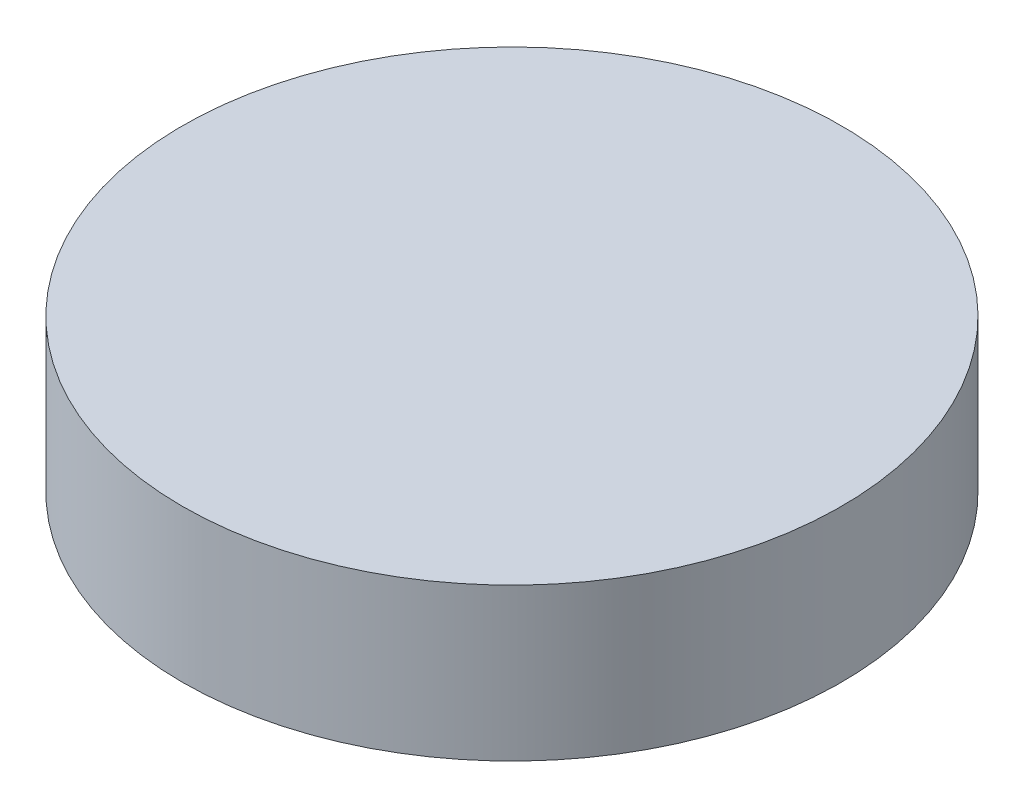
ISO-10303-21;
HEADER;
FILE_DESCRIPTION(('STEP AP214'),'2;1');
FILE_NAME('part.step','',(''),(''),'','','');
FILE_SCHEMA(('AUTOMOTIVE_DESIGN { 1 0 10303 214 1 1 1 1 }'));
ENDSEC;
DATA;
#1=APPLICATION_CONTEXT('core data for automotive mechanical design processes');
#2=APPLICATION_PROTOCOL_DEFINITION('international standard','automotive_design',2000,#1);
#3=PRODUCT_CONTEXT('',#1,'mechanical');
#4=PRODUCT('Part','Part','',(#3));
#5=PRODUCT_RELATED_PRODUCT_CATEGORY('part','',(#4));
#6=PRODUCT_DEFINITION_FORMATION('','',#4);
#7=PRODUCT_DEFINITION_CONTEXT('part definition',#1,'design');
#8=PRODUCT_DEFINITION('design','',#6,#7);
#9=PRODUCT_DEFINITION_SHAPE('','',#8);
#10=(LENGTH_UNIT() NAMED_UNIT(*) SI_UNIT(.MILLI.,.METRE.));
#11=(NAMED_UNIT(*) PLANE_ANGLE_UNIT() SI_UNIT($,.RADIAN.));
#12=(NAMED_UNIT(*) SI_UNIT($,.STERADIAN.) SOLID_ANGLE_UNIT());
#13=UNCERTAINTY_MEASURE_WITH_UNIT(LENGTH_MEASURE(1.E-05),#10,'distance_accuracy_value','');
#14=(GEOMETRIC_REPRESENTATION_CONTEXT(3) GLOBAL_UNCERTAINTY_ASSIGNED_CONTEXT((#13)) GLOBAL_UNIT_ASSIGNED_CONTEXT((#10,
#11,#12)) REPRESENTATION_CONTEXT('',''));
#15=CARTESIAN_POINT('',(0.,0.,0.));
#16=DIRECTION('',(0.,0.,1.));
#17=DIRECTION('',(1.,0.,0.));
#18=AXIS2_PLACEMENT_3D('',#15,#16,#17);
#19=CARTESIAN_POINT('',(0.,0.508,0.));
#20=DIRECTION('',(0.,-1.,0.));
#21=DIRECTION('',(0.,0.,-1.));
#22=AXIS2_PLACEMENT_3D('',#19,#20,#21);
#23=CYLINDRICAL_SURFACE('',#22,35.433);
#24=CARTESIAN_POINT('',(0.,0.508,0.));
#25=DIRECTION('',(0.,1.,0.));
#26=DIRECTION('',(0.,0.,1.));
#27=AXIS2_PLACEMENT_3D('',#24,#25,#26);
#28=CIRCLE('',#27,35.433);
#29=CARTESIAN_POINT('',(0.,0.508,35.433));
#30=VERTEX_POINT('',#29);
#31=EDGE_CURVE('E38',#30,#30,#28,.T.);
#32=ORIENTED_EDGE('',*,*,#31,.F.);
#33=EDGE_LOOP('',(#32));
#34=FACE_BOUND('',#33,.T.);
#35=CARTESIAN_POINT('',(0.,-15.875,0.));
#36=DIRECTION('',(0.,1.,0.));
#37=DIRECTION('',(0.,0.,1.));
#38=AXIS2_PLACEMENT_3D('',#35,#36,#37);
#39=CIRCLE('',#38,35.433);
#40=CARTESIAN_POINT('',(0.,-15.875,35.433));
#41=VERTEX_POINT('',#40);
#42=EDGE_CURVE('E42',#41,#41,#39,.T.);
#43=ORIENTED_EDGE('',*,*,#42,.T.);
#44=EDGE_LOOP('',(#43));
#45=FACE_BOUND('',#44,.T.);
#46=ADVANCED_FACE('F32',(#34,#45),#23,.T.);
#47=CARTESIAN_POINT('',(0.,0.508,0.));
#48=DIRECTION('',(0.,1.,0.));
#49=DIRECTION('',(0.,0.,1.));
#50=AXIS2_PLACEMENT_3D('',#47,#48,#49);
#51=PLANE('',#50);
#52=ORIENTED_EDGE('',*,*,#31,.T.);
#53=EDGE_LOOP('',(#52));
#54=FACE_BOUND('',#53,.T.);
#55=ADVANCED_FACE('F64',(#54),#51,.T.);
#56=CARTESIAN_POINT('',(0.,-15.875,0.));
#57=DIRECTION('',(0.,1.,0.));
#58=DIRECTION('',(0.,0.,1.));
#59=AXIS2_PLACEMENT_3D('',#56,#57,#58);
#60=PLANE('',#59);
#61=CARTESIAN_POINT('',(0.,-15.875,0.));
#62=DIRECTION('',(0.,1.,0.));
#63=DIRECTION('',(0.,0.,1.));
#64=AXIS2_PLACEMENT_3D('',#61,#62,#63);
#65=CIRCLE('',#64,34.925);
#66=CARTESIAN_POINT('',(0.,-15.875,34.925));
#67=VERTEX_POINT('',#66);
#68=EDGE_CURVE('E46',#67,#67,#65,.T.);
#69=ORIENTED_EDGE('',*,*,#68,.T.);
#70=EDGE_LOOP('',(#69));
#71=FACE_BOUND('',#70,.T.);
#72=ORIENTED_EDGE('',*,*,#42,.F.);
#73=EDGE_LOOP('',(#72));
#74=FACE_BOUND('',#73,.T.);
#75=ADVANCED_FACE('F52',(#71,#74),#60,.F.);
#76=CARTESIAN_POINT('',(0.,-15.875,0.));
#77=DIRECTION('',(0.,1.,0.));
#78=DIRECTION('',(0.,0.,1.));
#79=AXIS2_PLACEMENT_3D('',#76,#77,#78);
#80=CYLINDRICAL_SURFACE('',#79,34.925);
#81=ORIENTED_EDGE('',*,*,#68,.F.);
#82=EDGE_LOOP('',(#81));
#83=FACE_BOUND('',#82,.T.);
#84=CARTESIAN_POINT('',(0.,0.,0.));
#85=DIRECTION('',(0.,1.,0.));
#86=DIRECTION('',(0.,0.,1.));
#87=AXIS2_PLACEMENT_3D('',#84,#85,#86);
#88=CIRCLE('',#87,34.925);
#89=CARTESIAN_POINT('',(0.,0.,34.925));
#90=VERTEX_POINT('',#89);
#91=EDGE_CURVE('E10',#90,#90,#88,.T.);
#92=ORIENTED_EDGE('',*,*,#91,.T.);
#93=EDGE_LOOP('',(#92));
#94=FACE_BOUND('',#93,.T.);
#95=ADVANCED_FACE('F55',(#83,#94),#80,.F.);
#96=CARTESIAN_POINT('',(0.,0.,0.));
#97=DIRECTION('',(0.,1.,0.));
#98=DIRECTION('',(0.,0.,1.));
#99=AXIS2_PLACEMENT_3D('',#96,#97,#98);
#100=PLANE('',#99);
#101=ORIENTED_EDGE('',*,*,#91,.F.);
#102=EDGE_LOOP('',(#101));
#103=FACE_BOUND('',#102,.T.);
#104=ADVANCED_FACE('F57',(#103),#100,.F.);
#105=CLOSED_SHELL('',(#46,#55,#75,#95,#104));
#106=MANIFOLD_SOLID_BREP('B2',#105);
#107=ADVANCED_BREP_SHAPE_REPRESENTATION('',(#18,#106),#14);
#108=SHAPE_DEFINITION_REPRESENTATION(#9,#107);
ENDSEC;
END-ISO-10303-21;
